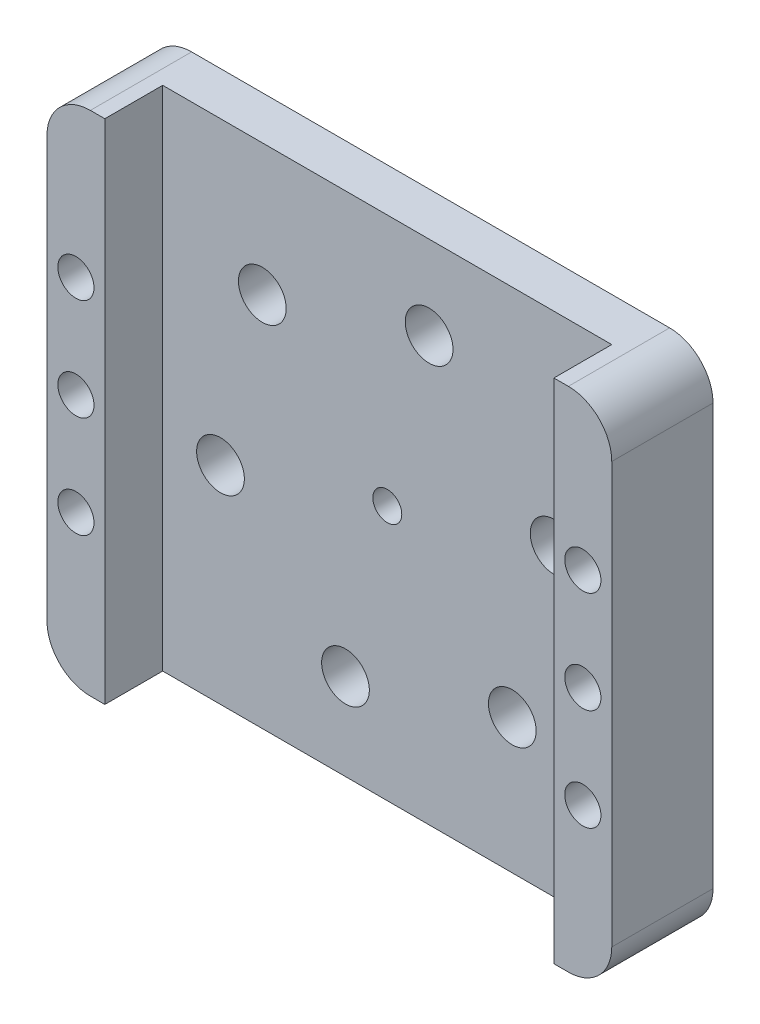
ISO-10303-21;
HEADER;
FILE_DESCRIPTION(('STEP AP214'),'2;1');
FILE_NAME('part.step','',(''),(''),'','','');
FILE_SCHEMA(('AUTOMOTIVE_DESIGN { 1 0 10303 214 1 1 1 1 }'));
ENDSEC;
DATA;
#1=APPLICATION_CONTEXT('core data for automotive mechanical design processes');
#2=APPLICATION_PROTOCOL_DEFINITION('international standard','automotive_design',2000,#1);
#3=PRODUCT_CONTEXT('',#1,'mechanical');
#4=PRODUCT('Part','Part','',(#3));
#5=PRODUCT_RELATED_PRODUCT_CATEGORY('part','',(#4));
#6=PRODUCT_DEFINITION_FORMATION('','',#4);
#7=PRODUCT_DEFINITION_CONTEXT('part definition',#1,'design');
#8=PRODUCT_DEFINITION('design','',#6,#7);
#9=PRODUCT_DEFINITION_SHAPE('','',#8);
#10=(LENGTH_UNIT() NAMED_UNIT(*) SI_UNIT(.MILLI.,.METRE.));
#11=(NAMED_UNIT(*) PLANE_ANGLE_UNIT() SI_UNIT($,.RADIAN.));
#12=(NAMED_UNIT(*) SI_UNIT($,.STERADIAN.) SOLID_ANGLE_UNIT());
#13=UNCERTAINTY_MEASURE_WITH_UNIT(LENGTH_MEASURE(1.E-05),#10,'distance_accuracy_value','');
#14=(GEOMETRIC_REPRESENTATION_CONTEXT(3) GLOBAL_UNCERTAINTY_ASSIGNED_CONTEXT((#13)) GLOBAL_UNIT_ASSIGNED_CONTEXT((#10,
#11,#12)) REPRESENTATION_CONTEXT('',''));
#15=CARTESIAN_POINT('',(0.,0.,0.));
#16=DIRECTION('',(0.,0.,1.));
#17=DIRECTION('',(1.,0.,0.));
#18=AXIS2_PLACEMENT_3D('',#15,#16,#17);
#19=CARTESIAN_POINT('',(-73.6109892779795,0.,3.));
#20=DIRECTION('',(1.,0.,0.));
#21=DIRECTION('',(0.,0.,-1.));
#22=AXIS2_PLACEMENT_3D('',#19,#20,#21);
#23=PLANE('',#22);
#24=DIRECTION('',(0.,-1.,0.));
#25=VECTOR('',#24,1.);
#26=CARTESIAN_POINT('',(-73.6109892779795,22.5185430632102,7.));
#27=LINE('',#26,#25);
#28=CARTESIAN_POINT('',(-73.6109892779795,54.5893490204098,7.));
#29=VERTEX_POINT('',#28);
#30=CARTESIAN_POINT('',(-73.6109892779795,25.5185430632102,7.));
#31=VERTEX_POINT('',#30);
#32=EDGE_CURVE('E143',#29,#31,#27,.T.);
#33=ORIENTED_EDGE('',*,*,#32,.F.);
#34=DIRECTION('',(0.,0.,-1.));
#35=VECTOR('',#34,1.);
#36=CARTESIAN_POINT('',(-73.6109892779795,54.5893490204098,0.));
#37=LINE('',#36,#35);
#38=CARTESIAN_POINT('',(-73.6109892779795,54.5893490204098,0.));
#39=VERTEX_POINT('',#38);
#40=EDGE_CURVE('E272',#29,#39,#37,.T.);
#41=ORIENTED_EDGE('',*,*,#40,.T.);
#42=DIRECTION('',(0.,-1.,0.));
#43=VECTOR('',#42,1.);
#44=CARTESIAN_POINT('',(-73.6109892779795,0.,0.));
#45=LINE('',#44,#43);
#46=CARTESIAN_POINT('',(-73.6109892779795,25.5185430632102,0.));
#47=VERTEX_POINT('',#46);
#48=EDGE_CURVE('E235',#39,#47,#45,.T.);
#49=ORIENTED_EDGE('',*,*,#48,.T.);
#50=DIRECTION('',(0.,0.,-1.));
#51=VECTOR('',#50,1.);
#52=CARTESIAN_POINT('',(-73.6109892779795,25.5185430632102,3.));
#53=LINE('',#52,#51);
#54=EDGE_CURVE('E268',#47,#31,#53,.F.);
#55=ORIENTED_EDGE('',*,*,#54,.T.);
#56=EDGE_LOOP('',(#33,#41,#49,#55));
#57=FACE_BOUND('',#56,.T.);
#58=ADVANCED_FACE('F43',(#57),#23,.F.);
#59=CARTESIAN_POINT('',(0.,22.5185430632102,3.));
#60=DIRECTION('',(0.,1.,0.));
#61=DIRECTION('',(0.,0.,1.));
#62=AXIS2_PLACEMENT_3D('',#59,#60,#61);
#63=PLANE('',#62);
#64=DIRECTION('',(1.,0.,0.));
#65=VECTOR('',#64,1.);
#66=CARTESIAN_POINT('',(0.,22.5185430632102,0.));
#67=LINE('',#66,#65);
#68=CARTESIAN_POINT('',(-70.6109892779795,22.5185430632102,0.));
#69=VERTEX_POINT('',#68);
#70=CARTESIAN_POINT('',(-37.5658419240005,22.5185430632102,0.));
#71=VERTEX_POINT('',#70);
#72=EDGE_CURVE('E237',#69,#71,#67,.T.);
#73=ORIENTED_EDGE('',*,*,#72,.T.);
#74=DIRECTION('',(0.,0.,-1.));
#75=VECTOR('',#74,1.);
#76=CARTESIAN_POINT('',(-37.5658419240005,22.5185430632102,7.));
#77=LINE('',#76,#75);
#78=CARTESIAN_POINT('',(-37.5658419240005,22.5185430632102,7.));
#79=VERTEX_POINT('',#78);
#80=EDGE_CURVE('E51',#71,#79,#77,.F.);
#81=ORIENTED_EDGE('',*,*,#80,.T.);
#82=DIRECTION('',(1.,0.,0.));
#83=VECTOR('',#82,1.);
#84=CARTESIAN_POINT('',(-38.5658419240005,22.5185430632102,7.));
#85=LINE('',#84,#83);
#86=CARTESIAN_POINT('',(-38.5658419240005,22.5185430632102,7.));
#87=VERTEX_POINT('',#86);
#88=EDGE_CURVE('E180',#87,#79,#85,.T.);
#89=ORIENTED_EDGE('',*,*,#88,.F.);
#90=DIRECTION('',(0.,0.,-1.));
#91=VECTOR('',#90,1.);
#92=CARTESIAN_POINT('',(-38.5658419240005,22.5185430632102,7.));
#93=LINE('',#92,#91);
#94=CARTESIAN_POINT('',(-38.5658419240005,22.5185430632102,3.));
#95=VERTEX_POINT('',#94);
#96=EDGE_CURVE('E170',#87,#95,#93,.T.);
#97=ORIENTED_EDGE('',*,*,#96,.T.);
#98=DIRECTION('',(1.,0.,0.));
#99=VECTOR('',#98,1.);
#100=CARTESIAN_POINT('',(0.,22.5185430632102,3.));
#101=LINE('',#100,#99);
#102=CARTESIAN_POINT('',(-69.6109892779795,22.5185430632102,3.));
#103=VERTEX_POINT('',#102);
#104=EDGE_CURVE('E150',#103,#95,#101,.T.);
#105=ORIENTED_EDGE('',*,*,#104,.F.);
#106=DIRECTION('',(0.,0.,-1.));
#107=VECTOR('',#106,1.);
#108=CARTESIAN_POINT('',(-69.6109892779795,22.5185430632102,7.));
#109=LINE('',#108,#107);
#110=CARTESIAN_POINT('',(-69.6109892779795,22.5185430632102,7.));
#111=VERTEX_POINT('',#110);
#112=EDGE_CURVE('E147',#111,#103,#109,.T.);
#113=ORIENTED_EDGE('',*,*,#112,.F.);
#114=DIRECTION('',(1.,0.,0.));
#115=VECTOR('',#114,1.);
#116=CARTESIAN_POINT('',(-73.6109892779795,22.5185430632102,7.));
#117=LINE('',#116,#115);
#118=CARTESIAN_POINT('',(-70.6109892779795,22.5185430632102,7.));
#119=VERTEX_POINT('',#118);
#120=EDGE_CURVE('E131',#119,#111,#117,.T.);
#121=ORIENTED_EDGE('',*,*,#120,.F.);
#122=DIRECTION('',(0.,0.,-1.));
#123=VECTOR('',#122,1.);
#124=CARTESIAN_POINT('',(-70.6109892779795,22.5185430632102,3.));
#125=LINE('',#124,#123);
#126=EDGE_CURVE('E217',#119,#69,#125,.T.);
#127=ORIENTED_EDGE('',*,*,#126,.T.);
#128=EDGE_LOOP('',(#73,#81,#89,#97,#105,#113,#121,#127));
#129=FACE_BOUND('',#128,.T.);
#130=ADVANCED_FACE('F148',(#129),#63,.F.);
#131=CARTESIAN_POINT('',(-34.5658419240005,0.,3.));
#132=DIRECTION('',(1.,0.,0.));
#133=DIRECTION('',(0.,0.,-1.));
#134=AXIS2_PLACEMENT_3D('',#131,#132,#133);
#135=PLANE('',#134);
#136=DIRECTION('',(0.,1.,0.));
#137=VECTOR('',#136,1.);
#138=CARTESIAN_POINT('',(-34.5658419240005,22.5185430632102,7.));
#139=LINE('',#138,#137);
#140=CARTESIAN_POINT('',(-34.5658419240005,25.5185430632102,7.));
#141=VERTEX_POINT('',#140);
#142=CARTESIAN_POINT('',(-34.5658419240005,54.5893490204098,7.));
#143=VERTEX_POINT('',#142);
#144=EDGE_CURVE('E173',#141,#143,#139,.T.);
#145=ORIENTED_EDGE('',*,*,#144,.F.);
#146=DIRECTION('',(0.,0.,-1.));
#147=VECTOR('',#146,1.);
#148=CARTESIAN_POINT('',(-34.5658419240005,25.5185430632102,0.));
#149=LINE('',#148,#147);
#150=CARTESIAN_POINT('',(-34.5658419240005,25.5185430632102,0.));
#151=VERTEX_POINT('',#150);
#152=EDGE_CURVE('E291',#141,#151,#149,.T.);
#153=ORIENTED_EDGE('',*,*,#152,.T.);
#154=DIRECTION('',(0.,-1.,0.));
#155=VECTOR('',#154,1.);
#156=CARTESIAN_POINT('',(-34.5658419240005,0.,0.));
#157=LINE('',#156,#155);
#158=CARTESIAN_POINT('',(-34.5658419240005,54.5893490204098,0.));
#159=VERTEX_POINT('',#158);
#160=EDGE_CURVE('E239',#159,#151,#157,.T.);
#161=ORIENTED_EDGE('',*,*,#160,.F.);
#162=DIRECTION('',(0.,0.,-1.));
#163=VECTOR('',#162,1.);
#164=CARTESIAN_POINT('',(-34.5658419240005,54.5893490204098,3.));
#165=LINE('',#164,#163);
#166=EDGE_CURVE('E286',#159,#143,#165,.F.);
#167=ORIENTED_EDGE('',*,*,#166,.T.);
#168=EDGE_LOOP('',(#145,#153,#161,#167));
#169=FACE_BOUND('',#168,.T.);
#170=ADVANCED_FACE('F298',(#169),#135,.T.);
#171=CARTESIAN_POINT('',(-51.1928450220887,51.8101817634537,3.));
#172=DIRECTION('',(0.,0.,-1.));
#173=DIRECTION('',(-1.,0.,0.));
#174=AXIS2_PLACEMENT_3D('',#171,#172,#173);
#175=CYLINDRICAL_SURFACE('',#174,1.65);
#176=CARTESIAN_POINT('',(-51.1928450220887,51.8101817634537,3.));
#177=DIRECTION('',(0.,0.,1.));
#178=DIRECTION('',(1.,0.,0.));
#179=AXIS2_PLACEMENT_3D('',#176,#177,#178);
#180=CIRCLE('',#179,1.65);
#181=CARTESIAN_POINT('',(-49.5428450220887,51.8101817634537,3.));
#182=VERTEX_POINT('',#181);
#183=EDGE_CURVE('E210',#182,#182,#180,.T.);
#184=ORIENTED_EDGE('',*,*,#183,.T.);
#185=EDGE_LOOP('',(#184));
#186=FACE_BOUND('',#185,.T.);
#187=CARTESIAN_POINT('',(-51.1928450220887,51.8101817634537,0.));
#188=DIRECTION('',(0.,0.,1.));
#189=DIRECTION('',(1.,0.,0.));
#190=AXIS2_PLACEMENT_3D('',#187,#188,#189);
#191=CIRCLE('',#190,1.65);
#192=CARTESIAN_POINT('',(-49.5428450220887,51.8101817634537,0.));
#193=VERTEX_POINT('',#192);
#194=EDGE_CURVE('E232',#193,#193,#191,.T.);
#195=ORIENTED_EDGE('',*,*,#194,.F.);
#196=EDGE_LOOP('',(#195));
#197=FACE_BOUND('',#196,.T.);
#198=ADVANCED_FACE('F338',(#186,#197),#175,.F.);
#199=CARTESIAN_POINT('',(-42.5520428181534,43.483325377494,3.));
#200=DIRECTION('',(0.,0.,-1.));
#201=DIRECTION('',(-1.,0.,0.));
#202=AXIS2_PLACEMENT_3D('',#199,#200,#201);
#203=CYLINDRICAL_SURFACE('',#202,1.64999999999998);
#204=CARTESIAN_POINT('',(-42.5520428181534,43.483325377494,3.));
#205=DIRECTION('',(0.,0.,1.));
#206=DIRECTION('',(1.,0.,0.));
#207=AXIS2_PLACEMENT_3D('',#204,#205,#206);
#208=CIRCLE('',#207,1.64999999999998);
#209=CARTESIAN_POINT('',(-40.9020428181534,43.483325377494,3.));
#210=VERTEX_POINT('',#209);
#211=EDGE_CURVE('E207',#210,#210,#208,.T.);
#212=ORIENTED_EDGE('',*,*,#211,.T.);
#213=EDGE_LOOP('',(#212));
#214=FACE_BOUND('',#213,.T.);
#215=CARTESIAN_POINT('',(-42.5520428181534,43.483325377494,0.));
#216=DIRECTION('',(0.,0.,1.));
#217=DIRECTION('',(1.,0.,0.));
#218=AXIS2_PLACEMENT_3D('',#215,#216,#217);
#219=CIRCLE('',#218,1.64999999999998);
#220=CARTESIAN_POINT('',(-40.9020428181534,43.483325377494,0.));
#221=VERTEX_POINT('',#220);
#222=EDGE_CURVE('E229',#221,#221,#219,.T.);
#223=ORIENTED_EDGE('',*,*,#222,.F.);
#224=EDGE_LOOP('',(#223));
#225=FACE_BOUND('',#224,.T.);
#226=ADVANCED_FACE('F341',(#214,#225),#203,.F.);
#227=CARTESIAN_POINT('',(-45.4429108800946,31.8367429668303,3.));
#228=DIRECTION('',(0.,0.,-1.));
#229=DIRECTION('',(-1.,0.,0.));
#230=AXIS2_PLACEMENT_3D('',#227,#228,#229);
#231=CYLINDRICAL_SURFACE('',#230,1.64999999999999);
#232=CARTESIAN_POINT('',(-45.4429108800946,31.8367429668303,3.));
#233=DIRECTION('',(0.,0.,1.));
#234=DIRECTION('',(1.,0.,0.));
#235=AXIS2_PLACEMENT_3D('',#232,#233,#234);
#236=CIRCLE('',#235,1.64999999999999);
#237=CARTESIAN_POINT('',(-43.7929108800946,31.8367429668303,3.));
#238=VERTEX_POINT('',#237);
#239=EDGE_CURVE('E204',#238,#238,#236,.T.);
#240=ORIENTED_EDGE('',*,*,#239,.T.);
#241=EDGE_LOOP('',(#240));
#242=FACE_BOUND('',#241,.T.);
#243=CARTESIAN_POINT('',(-45.4429108800946,31.8367429668303,0.));
#244=DIRECTION('',(0.,0.,1.));
#245=DIRECTION('',(1.,0.,0.));
#246=AXIS2_PLACEMENT_3D('',#243,#244,#245);
#247=CIRCLE('',#246,1.64999999999999);
#248=CARTESIAN_POINT('',(-43.7929108800946,31.8367429668303,0.));
#249=VERTEX_POINT('',#248);
#250=EDGE_CURVE('E226',#249,#249,#247,.T.);
#251=ORIENTED_EDGE('',*,*,#250,.F.);
#252=EDGE_LOOP('',(#251));
#253=FACE_BOUND('',#252,.T.);
#254=ADVANCED_FACE('F345',(#242,#253),#231,.F.);
#255=CARTESIAN_POINT('',(-56.9745811459713,28.5170169421263,3.));
#256=DIRECTION('',(0.,0.,-1.));
#257=DIRECTION('',(-1.,0.,0.));
#258=AXIS2_PLACEMENT_3D('',#255,#256,#257);
#259=CYLINDRICAL_SURFACE('',#258,1.65);
#260=CARTESIAN_POINT('',(-56.9745811459713,28.5170169421263,3.));
#261=DIRECTION('',(0.,0.,1.));
#262=DIRECTION('',(1.,0.,0.));
#263=AXIS2_PLACEMENT_3D('',#260,#261,#262);
#264=CIRCLE('',#263,1.65);
#265=CARTESIAN_POINT('',(-55.3245811459713,28.5170169421263,3.));
#266=VERTEX_POINT('',#265);
#267=EDGE_CURVE('E201',#266,#266,#264,.T.);
#268=ORIENTED_EDGE('',*,*,#267,.T.);
#269=EDGE_LOOP('',(#268));
#270=FACE_BOUND('',#269,.T.);
#271=CARTESIAN_POINT('',(-56.9745811459713,28.5170169421263,0.));
#272=DIRECTION('',(0.,0.,1.));
#273=DIRECTION('',(1.,0.,0.));
#274=AXIS2_PLACEMENT_3D('',#271,#272,#273);
#275=CIRCLE('',#274,1.65);
#276=CARTESIAN_POINT('',(-55.3245811459713,28.5170169421263,0.));
#277=VERTEX_POINT('',#276);
#278=EDGE_CURVE('E223',#277,#277,#275,.T.);
#279=ORIENTED_EDGE('',*,*,#278,.F.);
#280=EDGE_LOOP('',(#279));
#281=FACE_BOUND('',#280,.T.);
#282=ADVANCED_FACE('F349',(#270,#281),#259,.F.);
#283=CARTESIAN_POINT('',(-65.6153833499066,36.843873328086,3.));
#284=DIRECTION('',(0.,0.,-1.));
#285=DIRECTION('',(-1.,0.,0.));
#286=AXIS2_PLACEMENT_3D('',#283,#284,#285);
#287=CYLINDRICAL_SURFACE('',#286,1.65);
#288=CARTESIAN_POINT('',(-65.6153833499066,36.843873328086,3.));
#289=DIRECTION('',(0.,0.,1.));
#290=DIRECTION('',(1.,0.,0.));
#291=AXIS2_PLACEMENT_3D('',#288,#289,#290);
#292=CIRCLE('',#291,1.65);
#293=CARTESIAN_POINT('',(-63.9653833499066,36.843873328086,3.));
#294=VERTEX_POINT('',#293);
#295=EDGE_CURVE('E197',#294,#294,#292,.T.);
#296=ORIENTED_EDGE('',*,*,#295,.T.);
#297=EDGE_LOOP('',(#296));
#298=FACE_BOUND('',#297,.T.);
#299=CARTESIAN_POINT('',(-65.6153833499066,36.843873328086,0.));
#300=DIRECTION('',(0.,0.,1.));
#301=DIRECTION('',(1.,0.,0.));
#302=AXIS2_PLACEMENT_3D('',#299,#300,#301);
#303=CIRCLE('',#302,1.65);
#304=CARTESIAN_POINT('',(-63.9653833499066,36.843873328086,0.));
#305=VERTEX_POINT('',#304);
#306=EDGE_CURVE('E220',#305,#305,#303,.T.);
#307=ORIENTED_EDGE('',*,*,#306,.F.);
#308=EDGE_LOOP('',(#307));
#309=FACE_BOUND('',#308,.T.);
#310=ADVANCED_FACE('F353',(#298,#309),#287,.F.);
#311=CARTESIAN_POINT('',(-62.7245152879654,48.4904557387497,3.));
#312=DIRECTION('',(0.,0.,-1.));
#313=DIRECTION('',(-1.,0.,0.));
#314=AXIS2_PLACEMENT_3D('',#311,#312,#313);
#315=CYLINDRICAL_SURFACE('',#314,1.65);
#316=CARTESIAN_POINT('',(-62.7245152879654,48.4904557387497,3.));
#317=DIRECTION('',(0.,0.,1.));
#318=DIRECTION('',(1.,0.,0.));
#319=AXIS2_PLACEMENT_3D('',#316,#317,#318);
#320=CIRCLE('',#319,1.65);
#321=CARTESIAN_POINT('',(-61.0745152879654,48.4904557387497,3.));
#322=VERTEX_POINT('',#321);
#323=EDGE_CURVE('E194',#322,#322,#320,.T.);
#324=ORIENTED_EDGE('',*,*,#323,.T.);
#325=EDGE_LOOP('',(#324));
#326=FACE_BOUND('',#325,.T.);
#327=CARTESIAN_POINT('',(-62.7245152879654,48.4904557387497,0.));
#328=DIRECTION('',(0.,0.,1.));
#329=DIRECTION('',(1.,0.,0.));
#330=AXIS2_PLACEMENT_3D('',#327,#328,#329);
#331=CIRCLE('',#330,1.65);
#332=CARTESIAN_POINT('',(-61.0745152879654,48.4904557387497,0.));
#333=VERTEX_POINT('',#332);
#334=EDGE_CURVE('E153',#333,#333,#331,.T.);
#335=ORIENTED_EDGE('',*,*,#334,.F.);
#336=EDGE_LOOP('',(#335));
#337=FACE_BOUND('',#336,.T.);
#338=ADVANCED_FACE('F357',(#326,#337),#315,.F.);
#339=CARTESIAN_POINT('',(0.,57.5893490204098,3.));
#340=DIRECTION('',(0.,1.,0.));
#341=DIRECTION('',(0.,0.,1.));
#342=AXIS2_PLACEMENT_3D('',#339,#340,#341);
#343=PLANE('',#342);
#344=DIRECTION('',(-1.,0.,0.));
#345=VECTOR('',#344,1.);
#346=CARTESIAN_POINT('',(-34.5658419240005,57.5893490204098,7.));
#347=LINE('',#346,#345);
#348=CARTESIAN_POINT('',(-37.5658419240005,57.5893490204098,7.));
#349=VERTEX_POINT('',#348);
#350=CARTESIAN_POINT('',(-38.5658419240005,57.5893490204098,7.));
#351=VERTEX_POINT('',#350);
#352=EDGE_CURVE('E178',#349,#351,#347,.T.);
#353=ORIENTED_EDGE('',*,*,#352,.F.);
#354=DIRECTION('',(0.,0.,-1.));
#355=VECTOR('',#354,1.);
#356=CARTESIAN_POINT('',(-37.5658419240005,57.5893490204098,3.));
#357=LINE('',#356,#355);
#358=CARTESIAN_POINT('',(-37.5658419240005,57.5893490204098,0.));
#359=VERTEX_POINT('',#358);
#360=EDGE_CURVE('E281',#349,#359,#357,.T.);
#361=ORIENTED_EDGE('',*,*,#360,.T.);
#362=DIRECTION('',(1.,0.,0.));
#363=VECTOR('',#362,1.);
#364=CARTESIAN_POINT('',(0.,57.5893490204098,0.));
#365=LINE('',#364,#363);
#366=CARTESIAN_POINT('',(-70.6109892779795,57.5893490204098,0.));
#367=VERTEX_POINT('',#366);
#368=EDGE_CURVE('E198',#367,#359,#365,.T.);
#369=ORIENTED_EDGE('',*,*,#368,.F.);
#370=DIRECTION('',(0.,0.,-1.));
#371=VECTOR('',#370,1.);
#372=CARTESIAN_POINT('',(-70.6109892779795,57.5893490204098,7.));
#373=LINE('',#372,#371);
#374=CARTESIAN_POINT('',(-70.6109892779795,57.5893490204098,7.));
#375=VERTEX_POINT('',#374);
#376=EDGE_CURVE('E277',#367,#375,#373,.F.);
#377=ORIENTED_EDGE('',*,*,#376,.T.);
#378=DIRECTION('',(-1.,0.,0.));
#379=VECTOR('',#378,1.);
#380=CARTESIAN_POINT('',(-73.6109892779795,57.5893490204098,7.));
#381=LINE('',#380,#379);
#382=CARTESIAN_POINT('',(-69.6109892779795,57.5893490204098,7.));
#383=VERTEX_POINT('',#382);
#384=EDGE_CURVE('E164',#383,#375,#381,.T.);
#385=ORIENTED_EDGE('',*,*,#384,.F.);
#386=DIRECTION('',(0.,0.,-1.));
#387=VECTOR('',#386,1.);
#388=CARTESIAN_POINT('',(-69.6109892779795,57.5893490204098,7.));
#389=LINE('',#388,#387);
#390=CARTESIAN_POINT('',(-69.6109892779795,57.5893490204098,3.));
#391=VERTEX_POINT('',#390);
#392=EDGE_CURVE('E154',#383,#391,#389,.T.);
#393=ORIENTED_EDGE('',*,*,#392,.T.);
#394=DIRECTION('',(1.,0.,0.));
#395=VECTOR('',#394,1.);
#396=CARTESIAN_POINT('',(0.,57.5893490204098,3.));
#397=LINE('',#396,#395);
#398=CARTESIAN_POINT('',(-38.5658419240005,57.5893490204098,3.));
#399=VERTEX_POINT('',#398);
#400=EDGE_CURVE('E214',#391,#399,#397,.T.);
#401=ORIENTED_EDGE('',*,*,#400,.T.);
#402=DIRECTION('',(0.,0.,-1.));
#403=VECTOR('',#402,1.);
#404=CARTESIAN_POINT('',(-38.5658419240005,57.5893490204098,7.));
#405=LINE('',#404,#403);
#406=EDGE_CURVE('E167',#351,#399,#405,.T.);
#407=ORIENTED_EDGE('',*,*,#406,.F.);
#408=EDGE_LOOP('',(#353,#361,#369,#377,#385,#393,#401,#407));
#409=FACE_BOUND('',#408,.T.);
#410=ADVANCED_FACE('F310',(#409),#343,.T.);
#411=CARTESIAN_POINT('',(0.,0.,3.));
#412=DIRECTION('',(0.,0.,1.));
#413=DIRECTION('',(1.,0.,0.));
#414=AXIS2_PLACEMENT_3D('',#411,#412,#413);
#415=PLANE('',#414);
#416=CARTESIAN_POINT('',(-54.08371308403,40.16359935279,3.));
#417=DIRECTION('',(0.,0.,1.));
#418=DIRECTION('',(1.,0.,0.));
#419=AXIS2_PLACEMENT_3D('',#416,#417,#418);
#420=CIRCLE('',#419,0.999999999999998);
#421=CARTESIAN_POINT('',(-53.08371308403,40.16359935279,3.));
#422=VERTEX_POINT('',#421);
#423=EDGE_CURVE('E247',#422,#422,#420,.T.);
#424=ORIENTED_EDGE('',*,*,#423,.F.);
#425=EDGE_LOOP('',(#424));
#426=FACE_BOUND('',#425,.T.);
#427=DIRECTION('',(0.,1.,0.));
#428=VECTOR('',#427,1.);
#429=CARTESIAN_POINT('',(-69.6109892779795,57.5893490204098,3.));
#430=LINE('',#429,#428);
#431=EDGE_CURVE('E163',#103,#391,#430,.T.);
#432=ORIENTED_EDGE('',*,*,#431,.F.);
#433=ORIENTED_EDGE('',*,*,#104,.T.);
#434=DIRECTION('',(0.,-1.,0.));
#435=VECTOR('',#434,1.);
#436=CARTESIAN_POINT('',(-38.5658419240005,57.5893490204098,3.));
#437=LINE('',#436,#435);
#438=EDGE_CURVE('E174',#399,#95,#437,.T.);
#439=ORIENTED_EDGE('',*,*,#438,.F.);
#440=ORIENTED_EDGE('',*,*,#400,.F.);
#441=EDGE_LOOP('',(#432,#433,#439,#440));
#442=FACE_BOUND('',#441,.T.);
#443=ORIENTED_EDGE('',*,*,#323,.F.);
#444=EDGE_LOOP('',(#443));
#445=FACE_BOUND('',#444,.T.);
#446=ORIENTED_EDGE('',*,*,#295,.F.);
#447=EDGE_LOOP('',(#446));
#448=FACE_BOUND('',#447,.T.);
#449=ORIENTED_EDGE('',*,*,#267,.F.);
#450=EDGE_LOOP('',(#449));
#451=FACE_BOUND('',#450,.T.);
#452=ORIENTED_EDGE('',*,*,#239,.F.);
#453=EDGE_LOOP('',(#452));
#454=FACE_BOUND('',#453,.T.);
#455=ORIENTED_EDGE('',*,*,#211,.F.);
#456=EDGE_LOOP('',(#455));
#457=FACE_BOUND('',#456,.T.);
#458=ORIENTED_EDGE('',*,*,#183,.F.);
#459=EDGE_LOOP('',(#458));
#460=FACE_BOUND('',#459,.T.);
#461=ADVANCED_FACE('F389',(#426,#442,#445,#448,#451,#454,#457,#460),#415,.T.);
#462=CARTESIAN_POINT('',(0.,0.,0.));
#463=DIRECTION('',(0.,0.,1.));
#464=DIRECTION('',(1.,0.,0.));
#465=AXIS2_PLACEMENT_3D('',#462,#463,#464);
#466=PLANE('',#465);
#467=CARTESIAN_POINT('',(-36.5658419240005,47.0893490204098,0.));
#468=DIRECTION('',(0.,0.,1.));
#469=DIRECTION('',(1.,0.,0.));
#470=AXIS2_PLACEMENT_3D('',#467,#468,#469);
#471=CIRCLE('',#470,1.25);
#472=CARTESIAN_POINT('',(-35.3158419240005,47.0893490204098,0.));
#473=VERTEX_POINT('',#472);
#474=EDGE_CURVE('E171',#473,#473,#471,.T.);
#475=ORIENTED_EDGE('',*,*,#474,.T.);
#476=EDGE_LOOP('',(#475));
#477=FACE_BOUND('',#476,.T.);
#478=CARTESIAN_POINT('',(-71.6109892779795,33.0185430632102,0.));
#479=DIRECTION('',(0.,0.,1.));
#480=DIRECTION('',(1.,0.,0.));
#481=AXIS2_PLACEMENT_3D('',#478,#479,#480);
#482=CIRCLE('',#481,1.25);
#483=CARTESIAN_POINT('',(-70.3609892779795,33.0185430632102,0.));
#484=VERTEX_POINT('',#483);
#485=EDGE_CURVE('E259',#484,#484,#482,.T.);
#486=ORIENTED_EDGE('',*,*,#485,.T.);
#487=EDGE_LOOP('',(#486));
#488=FACE_BOUND('',#487,.T.);
#489=CARTESIAN_POINT('',(-71.6109892779795,40.05394604181,0.));
#490=DIRECTION('',(0.,0.,1.));
#491=DIRECTION('',(1.,0.,0.));
#492=AXIS2_PLACEMENT_3D('',#489,#490,#491);
#493=CIRCLE('',#492,1.25);
#494=CARTESIAN_POINT('',(-70.3609892779795,40.05394604181,0.));
#495=VERTEX_POINT('',#494);
#496=EDGE_CURVE('E256',#495,#495,#493,.T.);
#497=ORIENTED_EDGE('',*,*,#496,.T.);
#498=EDGE_LOOP('',(#497));
#499=FACE_BOUND('',#498,.T.);
#500=CARTESIAN_POINT('',(-71.6109892779795,47.0893490204098,0.));
#501=DIRECTION('',(0.,0.,1.));
#502=DIRECTION('',(1.,0.,0.));
#503=AXIS2_PLACEMENT_3D('',#500,#501,#502);
#504=CIRCLE('',#503,1.25);
#505=CARTESIAN_POINT('',(-70.3609892779795,47.0893490204098,0.));
#506=VERTEX_POINT('',#505);
#507=EDGE_CURVE('E253',#506,#506,#504,.T.);
#508=ORIENTED_EDGE('',*,*,#507,.T.);
#509=EDGE_LOOP('',(#508));
#510=FACE_BOUND('',#509,.T.);
#511=CARTESIAN_POINT('',(-36.5658419240005,40.05394604181,0.));
#512=DIRECTION('',(0.,0.,1.));
#513=DIRECTION('',(1.,0.,0.));
#514=AXIS2_PLACEMENT_3D('',#511,#512,#513);
#515=CIRCLE('',#514,1.25);
#516=CARTESIAN_POINT('',(-35.3158419240005,40.05394604181,0.));
#517=VERTEX_POINT('',#516);
#518=EDGE_CURVE('E250',#517,#517,#515,.T.);
#519=ORIENTED_EDGE('',*,*,#518,.T.);
#520=EDGE_LOOP('',(#519));
#521=FACE_BOUND('',#520,.T.);
#522=CARTESIAN_POINT('',(-36.5658419240005,33.0185430632102,0.));
#523=DIRECTION('',(0.,0.,1.));
#524=DIRECTION('',(1.,0.,0.));
#525=AXIS2_PLACEMENT_3D('',#522,#523,#524);
#526=CIRCLE('',#525,1.25);
#527=CARTESIAN_POINT('',(-35.3158419240005,33.0185430632102,0.));
#528=VERTEX_POINT('',#527);
#529=EDGE_CURVE('E246',#528,#528,#526,.T.);
#530=ORIENTED_EDGE('',*,*,#529,.T.);
#531=EDGE_LOOP('',(#530));
#532=FACE_BOUND('',#531,.T.);
#533=CARTESIAN_POINT('',(-54.08371308403,40.16359935279,0.));
#534=DIRECTION('',(0.,0.,1.));
#535=DIRECTION('',(1.,0.,0.));
#536=AXIS2_PLACEMENT_3D('',#533,#534,#535);
#537=CIRCLE('',#536,0.999999999999998);
#538=CARTESIAN_POINT('',(-53.08371308403,40.16359935279,0.));
#539=VERTEX_POINT('',#538);
#540=EDGE_CURVE('E243',#539,#539,#537,.T.);
#541=ORIENTED_EDGE('',*,*,#540,.T.);
#542=EDGE_LOOP('',(#541));
#543=FACE_BOUND('',#542,.T.);
#544=ORIENTED_EDGE('',*,*,#334,.T.);
#545=EDGE_LOOP('',(#544));
#546=FACE_BOUND('',#545,.T.);
#547=ORIENTED_EDGE('',*,*,#306,.T.);
#548=EDGE_LOOP('',(#547));
#549=FACE_BOUND('',#548,.T.);
#550=ORIENTED_EDGE('',*,*,#278,.T.);
#551=EDGE_LOOP('',(#550));
#552=FACE_BOUND('',#551,.T.);
#553=ORIENTED_EDGE('',*,*,#250,.T.);
#554=EDGE_LOOP('',(#553));
#555=FACE_BOUND('',#554,.T.);
#556=ORIENTED_EDGE('',*,*,#222,.T.);
#557=EDGE_LOOP('',(#556));
#558=FACE_BOUND('',#557,.T.);
#559=ORIENTED_EDGE('',*,*,#194,.T.);
#560=EDGE_LOOP('',(#559));
#561=FACE_BOUND('',#560,.T.);
#562=ORIENTED_EDGE('',*,*,#160,.T.);
#563=CARTESIAN_POINT('',(-37.5658419240005,25.5185430632102,0.));
#564=DIRECTION('',(0.,0.,1.));
#565=DIRECTION('',(1.,0.,0.));
#566=AXIS2_PLACEMENT_3D('',#563,#564,#565);
#567=CIRCLE('',#566,3.);
#568=EDGE_CURVE('E65',#151,#71,#567,.F.);
#569=ORIENTED_EDGE('',*,*,#568,.T.);
#570=ORIENTED_EDGE('',*,*,#72,.F.);
#571=CARTESIAN_POINT('',(-70.6109892779795,25.5185430632102,0.));
#572=DIRECTION('',(0.,0.,1.));
#573=DIRECTION('',(1.,0.,0.));
#574=AXIS2_PLACEMENT_3D('',#571,#572,#573);
#575=CIRCLE('',#574,3.);
#576=EDGE_CURVE('E265',#69,#47,#575,.F.);
#577=ORIENTED_EDGE('',*,*,#576,.T.);
#578=ORIENTED_EDGE('',*,*,#48,.F.);
#579=CARTESIAN_POINT('',(-70.6109892779795,54.5893490204098,0.));
#580=DIRECTION('',(0.,0.,1.));
#581=DIRECTION('',(1.,0.,0.));
#582=AXIS2_PLACEMENT_3D('',#579,#580,#581);
#583=CIRCLE('',#582,3.);
#584=EDGE_CURVE('E275',#39,#367,#583,.F.);
#585=ORIENTED_EDGE('',*,*,#584,.T.);
#586=ORIENTED_EDGE('',*,*,#368,.T.);
#587=CARTESIAN_POINT('',(-37.5658419240005,54.5893490204098,0.));
#588=DIRECTION('',(0.,0.,1.));
#589=DIRECTION('',(1.,0.,0.));
#590=AXIS2_PLACEMENT_3D('',#587,#588,#589);
#591=CIRCLE('',#590,3.);
#592=EDGE_CURVE('E284',#359,#159,#591,.F.);
#593=ORIENTED_EDGE('',*,*,#592,.T.);
#594=EDGE_LOOP('',(#562,#569,#570,#577,#578,#585,#586,#593));
#595=FACE_BOUND('',#594,.T.);
#596=ADVANCED_FACE('F302',(#477,#488,#499,#510,#521,#532,#543,#546,#549,#552,#555,#558,#561,
#595),#466,.F.);
#597=CARTESIAN_POINT('',(0.,0.,7.));
#598=DIRECTION('',(0.,0.,1.));
#599=DIRECTION('',(1.,0.,0.));
#600=AXIS2_PLACEMENT_3D('',#597,#598,#599);
#601=PLANE('',#600);
#602=CARTESIAN_POINT('',(-36.5658419240005,33.0185430632102,7.));
#603=DIRECTION('',(0.,0.,1.));
#604=DIRECTION('',(1.,0.,0.));
#605=AXIS2_PLACEMENT_3D('',#602,#603,#604);
#606=CIRCLE('',#605,1.25);
#607=CARTESIAN_POINT('',(-35.3158419240005,33.0185430632102,7.));
#608=VERTEX_POINT('',#607);
#609=EDGE_CURVE('E187',#608,#608,#606,.T.);
#610=ORIENTED_EDGE('',*,*,#609,.F.);
#611=EDGE_LOOP('',(#610));
#612=FACE_BOUND('',#611,.T.);
#613=ORIENTED_EDGE('',*,*,#88,.T.);
#614=CARTESIAN_POINT('',(-37.5658419240005,25.5185430632102,7.));
#615=DIRECTION('',(0.,0.,1.));
#616=DIRECTION('',(1.,0.,0.));
#617=AXIS2_PLACEMENT_3D('',#614,#615,#616);
#618=CIRCLE('',#617,3.);
#619=EDGE_CURVE('E11',#79,#141,#618,.T.);
#620=ORIENTED_EDGE('',*,*,#619,.T.);
#621=ORIENTED_EDGE('',*,*,#144,.T.);
#622=CARTESIAN_POINT('',(-37.5658419240005,54.5893490204098,7.));
#623=DIRECTION('',(0.,0.,1.));
#624=DIRECTION('',(1.,0.,0.));
#625=AXIS2_PLACEMENT_3D('',#622,#623,#624);
#626=CIRCLE('',#625,3.);
#627=EDGE_CURVE('E289',#143,#349,#626,.T.);
#628=ORIENTED_EDGE('',*,*,#627,.T.);
#629=ORIENTED_EDGE('',*,*,#352,.T.);
#630=DIRECTION('',(0.,-1.,0.));
#631=VECTOR('',#630,1.);
#632=CARTESIAN_POINT('',(-38.5658419240005,57.5893490204098,7.));
#633=LINE('',#632,#631);
#634=EDGE_CURVE('E182',#351,#87,#633,.T.);
#635=ORIENTED_EDGE('',*,*,#634,.T.);
#636=EDGE_LOOP('',(#613,#620,#621,#628,#629,#635));
#637=FACE_BOUND('',#636,.T.);
#638=CARTESIAN_POINT('',(-36.5658419240005,40.05394604181,7.));
#639=DIRECTION('',(0.,0.,1.));
#640=DIRECTION('',(1.,0.,0.));
#641=AXIS2_PLACEMENT_3D('',#638,#639,#640);
#642=CIRCLE('',#641,1.25);
#643=CARTESIAN_POINT('',(-35.3158419240005,40.05394604181,7.));
#644=VERTEX_POINT('',#643);
#645=EDGE_CURVE('E177',#644,#644,#642,.T.);
#646=ORIENTED_EDGE('',*,*,#645,.F.);
#647=EDGE_LOOP('',(#646));
#648=FACE_BOUND('',#647,.T.);
#649=CARTESIAN_POINT('',(-36.5658419240005,47.0893490204098,7.));
#650=DIRECTION('',(0.,0.,1.));
#651=DIRECTION('',(1.,0.,0.));
#652=AXIS2_PLACEMENT_3D('',#649,#650,#651);
#653=CIRCLE('',#652,1.25);
#654=CARTESIAN_POINT('',(-35.3158419240005,47.0893490204098,7.));
#655=VERTEX_POINT('',#654);
#656=EDGE_CURVE('E190',#655,#655,#653,.T.);
#657=ORIENTED_EDGE('',*,*,#656,.F.);
#658=EDGE_LOOP('',(#657));
#659=FACE_BOUND('',#658,.T.);
#660=ADVANCED_FACE('F315',(#612,#637,#648,#659),#601,.T.);
#661=CARTESIAN_POINT('',(-38.5658419240005,57.5893490204098,7.));
#662=DIRECTION('',(1.,0.,0.));
#663=DIRECTION('',(0.,0.,-1.));
#664=AXIS2_PLACEMENT_3D('',#661,#662,#663);
#665=PLANE('',#664);
#666=ORIENTED_EDGE('',*,*,#438,.T.);
#667=ORIENTED_EDGE('',*,*,#96,.F.);
#668=ORIENTED_EDGE('',*,*,#634,.F.);
#669=ORIENTED_EDGE('',*,*,#406,.T.);
#670=EDGE_LOOP('',(#666,#667,#668,#669));
#671=FACE_BOUND('',#670,.T.);
#672=ADVANCED_FACE('F319',(#671),#665,.F.);
#673=CARTESIAN_POINT('',(-36.5658419240005,40.05394604181,7.));
#674=DIRECTION('',(0.,0.,-1.));
#675=DIRECTION('',(-1.,0.,0.));
#676=AXIS2_PLACEMENT_3D('',#673,#674,#675);
#677=CYLINDRICAL_SURFACE('',#676,1.25);
#678=ORIENTED_EDGE('',*,*,#645,.T.);
#679=EDGE_LOOP('',(#678));
#680=FACE_BOUND('',#679,.T.);
#681=ORIENTED_EDGE('',*,*,#518,.F.);
#682=EDGE_LOOP('',(#681));
#683=FACE_BOUND('',#682,.T.);
#684=ADVANCED_FACE('F455',(#680,#683),#677,.F.);
#685=CARTESIAN_POINT('',(-36.5658419240005,33.0185430632102,7.));
#686=DIRECTION('',(0.,0.,-1.));
#687=DIRECTION('',(-1.,0.,0.));
#688=AXIS2_PLACEMENT_3D('',#685,#686,#687);
#689=CYLINDRICAL_SURFACE('',#688,1.25);
#690=ORIENTED_EDGE('',*,*,#609,.T.);
#691=EDGE_LOOP('',(#690));
#692=FACE_BOUND('',#691,.T.);
#693=ORIENTED_EDGE('',*,*,#529,.F.);
#694=EDGE_LOOP('',(#693));
#695=FACE_BOUND('',#694,.T.);
#696=ADVANCED_FACE('F466',(#692,#695),#689,.F.);
#697=CARTESIAN_POINT('',(-36.5658419240005,47.0893490204098,7.));
#698=DIRECTION('',(0.,0.,-1.));
#699=DIRECTION('',(-1.,0.,0.));
#700=AXIS2_PLACEMENT_3D('',#697,#698,#699);
#701=CYLINDRICAL_SURFACE('',#700,1.25);
#702=ORIENTED_EDGE('',*,*,#656,.T.);
#703=EDGE_LOOP('',(#702));
#704=FACE_BOUND('',#703,.T.);
#705=ORIENTED_EDGE('',*,*,#474,.F.);
#706=EDGE_LOOP('',(#705));
#707=FACE_BOUND('',#706,.T.);
#708=ADVANCED_FACE('F479',(#704,#707),#701,.F.);
#709=CARTESIAN_POINT('',(0.,0.,7.));
#710=DIRECTION('',(0.,0.,-1.));
#711=DIRECTION('',(-1.,0.,0.));
#712=AXIS2_PLACEMENT_3D('',#709,#710,#711);
#713=PLANE('',#712);
#714=ORIENTED_EDGE('',*,*,#384,.T.);
#715=CARTESIAN_POINT('',(-70.6109892779795,54.5893490204098,7.));
#716=DIRECTION('',(0.,0.,-1.));
#717=DIRECTION('',(-1.,0.,0.));
#718=AXIS2_PLACEMENT_3D('',#715,#716,#717);
#719=CIRCLE('',#718,3.);
#720=EDGE_CURVE('E279',#375,#29,#719,.F.);
#721=ORIENTED_EDGE('',*,*,#720,.T.);
#722=ORIENTED_EDGE('',*,*,#32,.T.);
#723=CARTESIAN_POINT('',(-70.6109892779795,25.5185430632102,7.));
#724=DIRECTION('',(0.,0.,-1.));
#725=DIRECTION('',(-1.,0.,0.));
#726=AXIS2_PLACEMENT_3D('',#723,#724,#725);
#727=CIRCLE('',#726,3.);
#728=EDGE_CURVE('E140',#31,#119,#727,.F.);
#729=ORIENTED_EDGE('',*,*,#728,.T.);
#730=ORIENTED_EDGE('',*,*,#120,.T.);
#731=DIRECTION('',(0.,1.,0.));
#732=VECTOR('',#731,1.);
#733=CARTESIAN_POINT('',(-69.6109892779795,57.5893490204098,7.));
#734=LINE('',#733,#732);
#735=EDGE_CURVE('E137',#111,#383,#734,.T.);
#736=ORIENTED_EDGE('',*,*,#735,.T.);
#737=EDGE_LOOP('',(#714,#721,#722,#729,#730,#736));
#738=FACE_BOUND('',#737,.T.);
#739=CARTESIAN_POINT('',(-71.6109892779795,47.0893490204098,7.));
#740=DIRECTION('',(0.,0.,1.));
#741=DIRECTION('',(1.,0.,0.));
#742=AXIS2_PLACEMENT_3D('',#739,#740,#741);
#743=CIRCLE('',#742,1.25);
#744=CARTESIAN_POINT('',(-70.3609892779795,47.0893490204098,7.));
#745=VERTEX_POINT('',#744);
#746=EDGE_CURVE('E165',#745,#745,#743,.T.);
#747=ORIENTED_EDGE('',*,*,#746,.F.);
#748=EDGE_LOOP('',(#747));
#749=FACE_BOUND('',#748,.T.);
#750=CARTESIAN_POINT('',(-71.6109892779795,33.0185430632102,7.));
#751=DIRECTION('',(0.,0.,1.));
#752=DIRECTION('',(1.,0.,0.));
#753=AXIS2_PLACEMENT_3D('',#750,#751,#752);
#754=CIRCLE('',#753,1.25);
#755=CARTESIAN_POINT('',(-70.3609892779795,33.0185430632102,7.));
#756=VERTEX_POINT('',#755);
#757=EDGE_CURVE('E379',#756,#756,#754,.T.);
#758=ORIENTED_EDGE('',*,*,#757,.F.);
#759=EDGE_LOOP('',(#758));
#760=FACE_BOUND('',#759,.T.);
#761=CARTESIAN_POINT('',(-71.6109892779795,40.05394604181,7.));
#762=DIRECTION('',(0.,0.,1.));
#763=DIRECTION('',(1.,0.,0.));
#764=AXIS2_PLACEMENT_3D('',#761,#762,#763);
#765=CIRCLE('',#764,1.25);
#766=CARTESIAN_POINT('',(-70.3609892779795,40.05394604181,7.));
#767=VERTEX_POINT('',#766);
#768=EDGE_CURVE('E193',#767,#767,#765,.T.);
#769=ORIENTED_EDGE('',*,*,#768,.F.);
#770=EDGE_LOOP('',(#769));
#771=FACE_BOUND('',#770,.T.);
#772=ADVANCED_FACE('F134',(#738,#749,#760,#771),#713,.F.);
#773=CARTESIAN_POINT('',(-69.6109892779795,57.5893490204098,7.));
#774=DIRECTION('',(-1.,0.,0.));
#775=DIRECTION('',(0.,0.,1.));
#776=AXIS2_PLACEMENT_3D('',#773,#774,#775);
#777=PLANE('',#776);
#778=ORIENTED_EDGE('',*,*,#431,.T.);
#779=ORIENTED_EDGE('',*,*,#392,.F.);
#780=ORIENTED_EDGE('',*,*,#735,.F.);
#781=ORIENTED_EDGE('',*,*,#112,.T.);
#782=EDGE_LOOP('',(#778,#779,#780,#781));
#783=FACE_BOUND('',#782,.T.);
#784=ADVANCED_FACE('F156',(#783),#777,.F.);
#785=CARTESIAN_POINT('',(-71.6109892779795,47.0893490204098,7.));
#786=DIRECTION('',(0.,0.,-1.));
#787=DIRECTION('',(-1.,0.,0.));
#788=AXIS2_PLACEMENT_3D('',#785,#786,#787);
#789=CYLINDRICAL_SURFACE('',#788,1.25);
#790=ORIENTED_EDGE('',*,*,#746,.T.);
#791=EDGE_LOOP('',(#790));
#792=FACE_BOUND('',#791,.T.);
#793=ORIENTED_EDGE('',*,*,#507,.F.);
#794=EDGE_LOOP('',(#793));
#795=FACE_BOUND('',#794,.T.);
#796=ADVANCED_FACE('F507',(#792,#795),#789,.F.);
#797=CARTESIAN_POINT('',(-71.6109892779795,33.0185430632102,7.));
#798=DIRECTION('',(0.,0.,-1.));
#799=DIRECTION('',(-1.,0.,0.));
#800=AXIS2_PLACEMENT_3D('',#797,#798,#799);
#801=CYLINDRICAL_SURFACE('',#800,1.25);
#802=ORIENTED_EDGE('',*,*,#757,.T.);
#803=EDGE_LOOP('',(#802));
#804=FACE_BOUND('',#803,.T.);
#805=ORIENTED_EDGE('',*,*,#485,.F.);
#806=EDGE_LOOP('',(#805));
#807=FACE_BOUND('',#806,.T.);
#808=ADVANCED_FACE('F516',(#804,#807),#801,.F.);
#809=CARTESIAN_POINT('',(-71.6109892779795,40.05394604181,7.));
#810=DIRECTION('',(0.,0.,-1.));
#811=DIRECTION('',(-1.,0.,0.));
#812=AXIS2_PLACEMENT_3D('',#809,#810,#811);
#813=CYLINDRICAL_SURFACE('',#812,1.25);
#814=ORIENTED_EDGE('',*,*,#768,.T.);
#815=EDGE_LOOP('',(#814));
#816=FACE_BOUND('',#815,.T.);
#817=ORIENTED_EDGE('',*,*,#496,.F.);
#818=EDGE_LOOP('',(#817));
#819=FACE_BOUND('',#818,.T.);
#820=ADVANCED_FACE('F527',(#816,#819),#813,.F.);
#821=CARTESIAN_POINT('',(-54.08371308403,40.16359935279,-7.));
#822=DIRECTION('',(0.,0.,1.));
#823=DIRECTION('',(1.,0.,0.));
#824=AXIS2_PLACEMENT_3D('',#821,#822,#823);
#825=CYLINDRICAL_SURFACE('',#824,0.999999999999998);
#826=ORIENTED_EDGE('',*,*,#423,.T.);
#827=EDGE_LOOP('',(#826));
#828=FACE_BOUND('',#827,.T.);
#829=ORIENTED_EDGE('',*,*,#540,.F.);
#830=EDGE_LOOP('',(#829));
#831=FACE_BOUND('',#830,.T.);
#832=ADVANCED_FACE('F364',(#828,#831),#825,.F.);
#833=CARTESIAN_POINT('',(-70.6109892779795,25.5185430632102,3.));
#834=DIRECTION('',(0.,0.,-1.));
#835=DIRECTION('',(-1.,0.,0.));
#836=AXIS2_PLACEMENT_3D('',#833,#834,#835);
#837=CYLINDRICAL_SURFACE('',#836,3.);
#838=ORIENTED_EDGE('',*,*,#728,.F.);
#839=ORIENTED_EDGE('',*,*,#54,.F.);
#840=ORIENTED_EDGE('',*,*,#576,.F.);
#841=ORIENTED_EDGE('',*,*,#126,.F.);
#842=EDGE_LOOP('',(#838,#839,#840,#841));
#843=FACE_BOUND('',#842,.T.);
#844=ADVANCED_FACE('F362',(#843),#837,.T.);
#845=CARTESIAN_POINT('',(-70.6109892779795,54.5893490204098,3.));
#846=DIRECTION('',(0.,0.,1.));
#847=DIRECTION('',(1.,0.,0.));
#848=AXIS2_PLACEMENT_3D('',#845,#846,#847);
#849=CYLINDRICAL_SURFACE('',#848,3.);
#850=ORIENTED_EDGE('',*,*,#720,.F.);
#851=ORIENTED_EDGE('',*,*,#376,.F.);
#852=ORIENTED_EDGE('',*,*,#584,.F.);
#853=ORIENTED_EDGE('',*,*,#40,.F.);
#854=EDGE_LOOP('',(#850,#851,#852,#853));
#855=FACE_BOUND('',#854,.T.);
#856=ADVANCED_FACE('F325',(#855),#849,.T.);
#857=CARTESIAN_POINT('',(-37.5658419240005,54.5893490204098,3.));
#858=DIRECTION('',(0.,0.,-1.));
#859=DIRECTION('',(-1.,0.,0.));
#860=AXIS2_PLACEMENT_3D('',#857,#858,#859);
#861=CYLINDRICAL_SURFACE('',#860,3.);
#862=ORIENTED_EDGE('',*,*,#627,.F.);
#863=ORIENTED_EDGE('',*,*,#166,.F.);
#864=ORIENTED_EDGE('',*,*,#592,.F.);
#865=ORIENTED_EDGE('',*,*,#360,.F.);
#866=EDGE_LOOP('',(#862,#863,#864,#865));
#867=FACE_BOUND('',#866,.T.);
#868=ADVANCED_FACE('F307',(#867),#861,.T.);
#869=CARTESIAN_POINT('',(-37.5658419240005,25.5185430632102,3.));
#870=DIRECTION('',(0.,0.,1.));
#871=DIRECTION('',(1.,0.,0.));
#872=AXIS2_PLACEMENT_3D('',#869,#870,#871);
#873=CYLINDRICAL_SURFACE('',#872,3.);
#874=ORIENTED_EDGE('',*,*,#619,.F.);
#875=ORIENTED_EDGE('',*,*,#80,.F.);
#876=ORIENTED_EDGE('',*,*,#568,.F.);
#877=ORIENTED_EDGE('',*,*,#152,.F.);
#878=EDGE_LOOP('',(#874,#875,#876,#877));
#879=FACE_BOUND('',#878,.T.);
#880=ADVANCED_FACE('F45',(#879),#873,.T.);
#881=CLOSED_SHELL('',(#58,#130,#170,#198,#226,#254,#282,#310,#338,#410,#461,#596,#660,#672,#684,
#696,#708,#772,#784,#796,#808,#820,#832,#844,#856,#868,#880));
#882=MANIFOLD_SOLID_BREP('B2',#881);
#883=ADVANCED_BREP_SHAPE_REPRESENTATION('',(#18,#882),#14);
#884=SHAPE_DEFINITION_REPRESENTATION(#9,#883);
ENDSEC;
END-ISO-10303-21;
